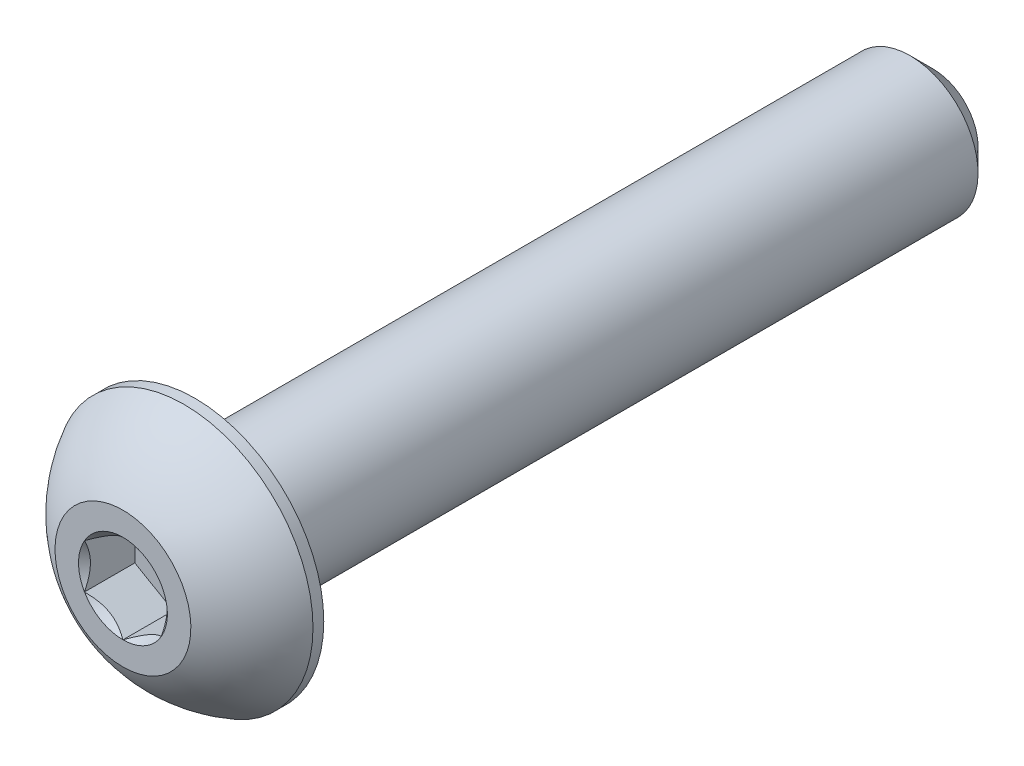
ISO-10303-21;
HEADER;
FILE_DESCRIPTION(('STEP AP214'),'2;1');
FILE_NAME('part.step','',(''),(''),'','','');
FILE_SCHEMA(('AUTOMOTIVE_DESIGN { 1 0 10303 214 1 1 1 1 }'));
ENDSEC;
DATA;
#1=APPLICATION_CONTEXT('core data for automotive mechanical design processes');
#2=APPLICATION_PROTOCOL_DEFINITION('international standard','automotive_design',2000,#1);
#3=PRODUCT_CONTEXT('',#1,'mechanical');
#4=PRODUCT('Part','Part','',(#3));
#5=PRODUCT_RELATED_PRODUCT_CATEGORY('part','',(#4));
#6=PRODUCT_DEFINITION_FORMATION('','',#4);
#7=PRODUCT_DEFINITION_CONTEXT('part definition',#1,'design');
#8=PRODUCT_DEFINITION('design','',#6,#7);
#9=PRODUCT_DEFINITION_SHAPE('','',#8);
#10=(LENGTH_UNIT() NAMED_UNIT(*) SI_UNIT(.MILLI.,.METRE.));
#11=(NAMED_UNIT(*) PLANE_ANGLE_UNIT() SI_UNIT($,.RADIAN.));
#12=(NAMED_UNIT(*) SI_UNIT($,.STERADIAN.) SOLID_ANGLE_UNIT());
#13=UNCERTAINTY_MEASURE_WITH_UNIT(LENGTH_MEASURE(1.E-05),#10,'distance_accuracy_value','');
#14=(GEOMETRIC_REPRESENTATION_CONTEXT(3) GLOBAL_UNCERTAINTY_ASSIGNED_CONTEXT((#13)) GLOBAL_UNIT_ASSIGNED_CONTEXT((#10,
#11,#12)) REPRESENTATION_CONTEXT('',''));
#15=CARTESIAN_POINT('',(0.,0.,0.));
#16=DIRECTION('',(0.,0.,1.));
#17=DIRECTION('',(1.,0.,0.));
#18=AXIS2_PLACEMENT_3D('',#15,#16,#17);
#19=CARTESIAN_POINT('',(0.,-1.7526,-20.9042));
#20=DIRECTION('',(0.,0.,-1.));
#21=DIRECTION('',(0.,1.,0.));
#22=AXIS2_PLACEMENT_3D('',#19,#20,#21);
#23=PLANE('',#22);
#24=CARTESIAN_POINT('',(0.,0.,-20.9042));
#25=DIRECTION('',(0.,0.,-1.));
#26=DIRECTION('',(0.,1.,0.));
#27=AXIS2_PLACEMENT_3D('',#24,#25,#26);
#28=CIRCLE('',#27,1.1572875);
#29=CARTESIAN_POINT('',(0.,1.15728750000001,-20.9042));
#30=VERTEX_POINT('',#29);
#31=EDGE_CURVE('E174',#30,#30,#28,.T.);
#32=ORIENTED_EDGE('',*,*,#31,.T.);
#33=EDGE_LOOP('',(#32));
#34=FACE_BOUND('',#33,.T.);
#35=ADVANCED_FACE('F34',(#34),#23,.T.);
#36=CARTESIAN_POINT('',(0.,0.,-20.9042));
#37=DIRECTION('',(0.,0.,-1.));
#38=DIRECTION('',(0.,1.,0.));
#39=AXIS2_PLACEMENT_3D('',#36,#37,#38);
#40=CYLINDRICAL_SURFACE('',#39,1.7526);
#41=CARTESIAN_POINT('',(0.,0.,-20.3088875));
#42=DIRECTION('',(0.,0.,-1.));
#43=DIRECTION('',(0.,1.,0.));
#44=AXIS2_PLACEMENT_3D('',#41,#42,#43);
#45=CIRCLE('',#44,1.7526);
#46=CARTESIAN_POINT('',(0.,1.7526,-20.3088875));
#47=VERTEX_POINT('',#46);
#48=EDGE_CURVE('E48',#47,#47,#45,.F.);
#49=ORIENTED_EDGE('',*,*,#48,.T.);
#50=EDGE_LOOP('',(#49));
#51=FACE_BOUND('',#50,.T.);
#52=CARTESIAN_POINT('',(0.,0.,-1.8542));
#53=DIRECTION('',(0.,0.,1.));
#54=DIRECTION('',(1.,0.,0.));
#55=AXIS2_PLACEMENT_3D('',#52,#53,#54);
#56=CIRCLE('',#55,1.7526);
#57=CARTESIAN_POINT('',(1.7526,0.,-1.8542));
#58=VERTEX_POINT('',#57);
#59=EDGE_CURVE('E171',#58,#58,#56,.F.);
#60=ORIENTED_EDGE('',*,*,#59,.T.);
#61=EDGE_LOOP('',(#60));
#62=FACE_BOUND('',#61,.T.);
#63=ADVANCED_FACE('F179',(#51,#62),#40,.T.);
#64=CARTESIAN_POINT('',(0.,0.,-20.9042));
#65=DIRECTION('',(0.,0.,1.));
#66=DIRECTION('',(0.,-1.,0.));
#67=AXIS2_PLACEMENT_3D('',#64,#65,#66);
#68=CONICAL_SURFACE('',#67,1.1572875,0.785398163397445);
#69=ORIENTED_EDGE('',*,*,#48,.F.);
#70=EDGE_LOOP('',(#69));
#71=FACE_BOUND('',#70,.T.);
#72=ORIENTED_EDGE('',*,*,#31,.F.);
#73=EDGE_LOOP('',(#72));
#74=FACE_BOUND('',#73,.T.);
#75=ADVANCED_FACE('F36',(#71,#74),#68,.T.);
#76=CARTESIAN_POINT('',(0.,0.,-3.32598826349718));
#77=DIRECTION('',(0.,0.,1.));
#78=DIRECTION('',(0.,-1.,0.));
#79=AXIS2_PLACEMENT_3D('',#76,#77,#78);
#80=SPHERICAL_SURFACE('',#79,3.75949527050121);
#81=CARTESIAN_POINT('',(0.,0.,0.));
#82=DIRECTION('',(0.,0.,1.));
#83=DIRECTION('',(1.,0.,0.));
#84=AXIS2_PLACEMENT_3D('',#81,#82,#83);
#85=CIRCLE('',#84,1.7526);
#86=CARTESIAN_POINT('',(0.,-1.7526,0.));
#87=VERTEX_POINT('',#86);
#88=EDGE_CURVE('E168',#87,#87,#85,.T.);
#89=CARTESIAN_POINT('',(0.,0.,-1.57607));
#90=DIRECTION('',(0.,0.,1.));
#91=DIRECTION('',(1.,0.,0.));
#92=AXIS2_PLACEMENT_3D('',#89,#90,#91);
#93=CIRCLE('',#92,3.3274);
#94=CARTESIAN_POINT('',(0.,-3.3274,-1.57607));
#95=VERTEX_POINT('',#94);
#96=EDGE_CURVE('E162',#95,#95,#93,.T.);
#97=CARTESIAN_POINT('',(0.,-1.7526,0.));
#98=CARTESIAN_POINT('',(0.,-1.77344521091165,-0.0109841671242039));
#99=CARTESIAN_POINT('',(0.,-1.79418713228591,-0.0221643495093442));
#100=CARTESIAN_POINT('',(0.,-1.83545712312919,-0.0449126843404109));
#101=CARTESIAN_POINT('',(0.,-1.85598519259821,-0.0564808367863374));
#102=CARTESIAN_POINT('',(0.,-1.89682020680057,-0.0800010512778898));
#103=CARTESIAN_POINT('',(0.,-1.9171271515339,-0.0919531133235156));
#104=CARTESIAN_POINT('',(0.,-1.95751274186056,-0.116236914088468));
#105=CARTESIAN_POINT('',(0.,-1.97759138745388,-0.128568652807795));
#106=CARTESIAN_POINT('',(0.,-2.01751328037423,-0.15360744962207));
#107=CARTESIAN_POINT('',(0.,-2.03735652770125,-0.166314507717019));
#108=CARTESIAN_POINT('',(0.,-2.07680060963244,-0.192099450667238));
#109=CARTESIAN_POINT('',(0.,-2.09640144423661,-0.205177335522508));
#110=CARTESIAN_POINT('',(0.,-2.13535377157089,-0.231699308994505));
#111=CARTESIAN_POINT('',(0.,-2.15470526430101,-0.245143397611231));
#112=CARTESIAN_POINT('',(0.,-2.19315206698496,-0.27239302596156));
#113=CARTESIAN_POINT('',(0.,-2.2122473769388,-0.286198565695163));
#114=CARTESIAN_POINT('',(0.,-2.25017506370288,-0.314166215909251));
#115=CARTESIAN_POINT('',(0.,-2.26900744051312,-0.328328326389737));
#116=CARTESIAN_POINT('',(0.,-2.3064026035794,-0.357004111663073));
#117=CARTESIAN_POINT('',(0.,-2.32496538983544,-0.371517786455924));
#118=CARTESIAN_POINT('',(0.,-2.36181480968332,-0.400891569642019));
#119=CARTESIAN_POINT('',(0.,-2.38010144327516,-0.415751678035262));
#120=CARTESIAN_POINT('',(0.,-2.41639209330763,-0.445813075241839));
#121=CARTESIAN_POINT('',(0.,-2.43439610974826,-0.461014364055173));
#122=CARTESIAN_POINT('',(0.,-2.47011516089881,-0.49175274831159));
#123=CARTESIAN_POINT('',(0.,-2.48783019560872,-0.507289843754673));
#124=CARTESIAN_POINT('',(0.,-2.52296502087598,-0.538694348769552));
#125=CARTESIAN_POINT('',(0.,-2.54038481143333,-0.554561758341348));
#126=CARTESIAN_POINT('',(0.,-2.57492299034501,-0.586621282343664));
#127=CARTESIAN_POINT('',(0.,-2.59204137869935,-0.602813396774184));
#128=CARTESIAN_POINT('',(0.,-2.62597070170293,-0.635516606437908));
#129=CARTESIAN_POINT('',(0.,-2.64278163635217,-0.652027701671111));
#130=CARTESIAN_POINT('',(0.,-2.67609010913108,-0.685363036121617));
#131=CARTESIAN_POINT('',(0.,-2.69258764726075,-0.70218727533892));
#132=CARTESIAN_POINT('',(0.,-2.72526349497449,-0.736142950239868));
#133=CARTESIAN_POINT('',(0.,-2.74144180455856,-0.753274385923513));
#134=CARTESIAN_POINT('',(0.,-2.7734734760052,-0.787838397642713));
#135=CARTESIAN_POINT('',(0.,-2.78932683786777,-0.805270973678267));
#136=CARTESIAN_POINT('',(0.,-2.82070300956741,-0.840431103531066));
#137=CARTESIAN_POINT('',(0.,-2.83622581940447,-0.858158657348309));
#138=CARTESIAN_POINT('',(0.,-2.86693539960216,-0.893902475917014));
#139=CARTESIAN_POINT('',(0.,-2.88212216996277,-0.911918740668475));
#140=CARTESIAN_POINT('',(0.,-2.91215430254962,-0.948233612196229));
#141=CARTESIAN_POINT('',(0.,-2.92699966477584,-0.966532218972523));
#142=CARTESIAN_POINT('',(0.,-2.9563437331265,-1.00340530583029));
#143=CARTESIAN_POINT('',(0.,-2.97084243925094,-1.02197978591176));
#144=CARTESIAN_POINT('',(0.,-2.99948806997761,-1.05939805313604));
#145=CARTESIAN_POINT('',(0.,-3.01363499457984,-1.07824184027885));
#146=CARTESIAN_POINT('',(0.,-3.04157206119591,-1.11619206018152));
#147=CARTESIAN_POINT('',(0.,-3.05536220320976,-1.13529849294138));
#148=CARTESIAN_POINT('',(0.,-3.08258082972231,-1.17376724977884));
#149=CARTESIAN_POINT('',(0.,-3.09600931422102,-1.19312957385645));
#150=CARTESIAN_POINT('',(0.,-3.12249987857489,-1.23210326859816));
#151=CARTESIAN_POINT('',(0.,-3.13556195843005,-1.25171463926226));
#152=CARTESIAN_POINT('',(0.,-3.16131509608524,-1.29117949430132));
#153=CARTESIAN_POINT('',(0.,-3.17400615388527,-1.31103297867626));
#154=CARTESIAN_POINT('',(0.,-3.19901276047088,-1.3509750430611));
#155=CARTESIAN_POINT('',(0.,-3.21132830925647,-1.37106362307099));
#156=CARTESIAN_POINT('',(0.,-3.23557954623934,-1.4114687760892));
#157=CARTESIAN_POINT('',(0.,-3.24751523443662,-1.43178534909752));
#158=CARTESIAN_POINT('',(0.,-3.27100252310173,-1.47263931029833));
#159=CARTESIAN_POINT('',(0.,-3.28255412356956,-1.49317669849081));
#160=CARTESIAN_POINT('',(0.,-3.30526918217882,-1.53446501395861));
#161=CARTESIAN_POINT('',(0.,-3.31643264032025,-1.55521594123393));
#162=CARTESIAN_POINT('',(0.,-3.3274,-1.57607));
#163=B_SPLINE_CURVE_WITH_KNOTS('',3,(#97,#98,#99,#100,#101,#102,#103,#104,#105,#106,#107,#108,
#109,#110,#111,#112,#113,#114,#115,#116,#117,#118,#119,#120,#121,#122,#123,#124,#125,#126,#127,
#128,#129,#130,#131,#132,#133,#134,#135,#136,#137,#138,#139,#140,#141,#142,#143,#144,#145,#146,
#147,#148,#149,#150,#151,#152,#153,#154,#155,#156,#157,#158,#159,#160,#161,#162),.UNSPECIFIED.,
.F.,.F.,(4,2,2,2,2,2,2,2,2,2,2,2,2,2,2,2,2,2,2,2,2,2,2,2,2,2,2,2,2,2,2,2,4),(0.,
0.0706853966104393,0.141370793220879,0.212056189831318,0.282741586441758,0.353426983052197,
0.424112379662636,0.494797776273076,0.565483172883515,0.636168569493955,0.706853966104394,
0.777539362714833,0.848224759325273,0.918910155935712,0.989595552546152,1.06028094915659,
1.13096634576703,1.20165174237747,1.27233713898791,1.34302253559835,1.41370793220879,
1.48439332881923,1.55507872542967,1.62576412204011,1.69644951865055,1.76713491526098,
1.83782031187142,1.90850570848186,1.9791911050923,2.04987650170274,2.12056189831318,
2.19124729492362,2.26193269153406),.UNSPECIFIED.);
#164=EDGE_CURVE('BSEAM184',#87,#95,#163,.T.);
#165=ORIENTED_EDGE('',*,*,#88,.F.);
#166=ORIENTED_EDGE('',*,*,#96,.T.);
#167=ORIENTED_EDGE('',*,*,#164,.T.);
#168=ORIENTED_EDGE('',*,*,#164,.F.);
#169=EDGE_LOOP('',(#165,#167,#166,#168));
#170=FACE_BOUND('',#169,.T.);
#171=ADVANCED_FACE('F184',(#170),#80,.T.);
#172=CARTESIAN_POINT('',(0.,-1.7526,0.));
#173=DIRECTION('',(0.,0.,-1.));
#174=DIRECTION('',(-1.,0.,0.));
#175=AXIS2_PLACEMENT_3D('',#172,#173,#174);
#176=PLANE('',#175);
#177=CARTESIAN_POINT('',(0.,0.,0.));
#178=DIRECTION('',(0.,0.,1.));
#179=DIRECTION('',(1.,0.,0.));
#180=AXIS2_PLACEMENT_3D('',#177,#178,#179);
#181=CIRCLE('',#180,1.14567944042316);
#182=CARTESIAN_POINT('',(-0.9921875,0.572839720211582,0.));
#183=VERTEX_POINT('',#182);
#184=CARTESIAN_POINT('',(-0.9921875,-0.572839720211582,0.));
#185=VERTEX_POINT('',#184);
#186=EDGE_CURVE('E61',#183,#185,#181,.T.);
#187=ORIENTED_EDGE('',*,*,#186,.F.);
#188=CARTESIAN_POINT('',(0.,1.14567944042316,0.));
#189=VERTEX_POINT('',#188);
#190=EDGE_CURVE('E133',#189,#183,#181,.T.);
#191=ORIENTED_EDGE('',*,*,#190,.F.);
#192=CARTESIAN_POINT('',(0.9921875,0.572839720211582,0.));
#193=VERTEX_POINT('',#192);
#194=EDGE_CURVE('E130',#193,#189,#181,.T.);
#195=ORIENTED_EDGE('',*,*,#194,.F.);
#196=CARTESIAN_POINT('',(0.9921875,-0.572839720211582,0.));
#197=VERTEX_POINT('',#196);
#198=EDGE_CURVE('E101',#197,#193,#181,.T.);
#199=ORIENTED_EDGE('',*,*,#198,.F.);
#200=CARTESIAN_POINT('',(0.,-1.14567944042316,0.));
#201=VERTEX_POINT('',#200);
#202=EDGE_CURVE('E93',#201,#197,#181,.T.);
#203=ORIENTED_EDGE('',*,*,#202,.F.);
#204=EDGE_CURVE('E54',#185,#201,#181,.T.);
#205=ORIENTED_EDGE('',*,*,#204,.F.);
#206=EDGE_LOOP('',(#187,#191,#195,#199,#203,#205));
#207=FACE_BOUND('',#206,.T.);
#208=ORIENTED_EDGE('',*,*,#88,.T.);
#209=EDGE_LOOP('',(#208));
#210=FACE_BOUND('',#209,.T.);
#211=ADVANCED_FACE('F127',(#207,#210),#176,.F.);
#212=CARTESIAN_POINT('',(0.,-3.3274,-1.8542));
#213=DIRECTION('',(0.,0.,1.));
#214=DIRECTION('',(1.,0.,0.));
#215=AXIS2_PLACEMENT_3D('',#212,#213,#214);
#216=PLANE('',#215);
#217=ORIENTED_EDGE('',*,*,#59,.F.);
#218=EDGE_LOOP('',(#217));
#219=FACE_BOUND('',#218,.T.);
#220=CARTESIAN_POINT('',(0.,0.,-1.8542));
#221=DIRECTION('',(0.,0.,1.));
#222=DIRECTION('',(1.,0.,0.));
#223=AXIS2_PLACEMENT_3D('',#220,#221,#222);
#224=CIRCLE('',#223,3.3274);
#225=CARTESIAN_POINT('',(3.3274,0.,-1.8542));
#226=VERTEX_POINT('',#225);
#227=EDGE_CURVE('E165',#226,#226,#224,.T.);
#228=ORIENTED_EDGE('',*,*,#227,.F.);
#229=EDGE_LOOP('',(#228));
#230=FACE_BOUND('',#229,.T.);
#231=ADVANCED_FACE('F198',(#219,#230),#216,.F.);
#232=CARTESIAN_POINT('',(0.,0.,0.));
#233=DIRECTION('',(0.,0.,1.));
#234=DIRECTION('',(1.,0.,0.));
#235=AXIS2_PLACEMENT_3D('',#232,#233,#234);
#236=CYLINDRICAL_SURFACE('',#235,3.3274);
#237=ORIENTED_EDGE('',*,*,#96,.F.);
#238=EDGE_LOOP('',(#237));
#239=FACE_BOUND('',#238,.T.);
#240=ORIENTED_EDGE('',*,*,#227,.T.);
#241=EDGE_LOOP('',(#240));
#242=FACE_BOUND('',#241,.T.);
#243=ADVANCED_FACE('F201',(#239,#242),#236,.T.);
#244=CARTESIAN_POINT('',(0.,0.,0.));
#245=DIRECTION('',(0.,0.,1.));
#246=DIRECTION('',(1.,0.,0.));
#247=AXIS2_PLACEMENT_3D('',#244,#245,#246);
#248=CONICAL_SURFACE('',#247,1.14567944042316,0.78539816339745);
#249=ORIENTED_EDGE('',*,*,#198,.T.);
#250=CARTESIAN_POINT('',(0.9921875,-1.14247621078911,0.367492039408284));
#251=CARTESIAN_POINT('',(0.9921875,-1.11465764801141,0.346491639249698));
#252=CARTESIAN_POINT('',(0.9921875,-1.08668408094051,0.325697147705785));
#253=CARTESIAN_POINT('',(0.9921875,-1.03036405365905,0.284605037686905));
#254=CARTESIAN_POINT('',(0.9921875,-1.00201750223733,0.264307544357067));
#255=CARTESIAN_POINT('',(0.9921875,-0.915909012346496,0.203998507493926));
#256=CARTESIAN_POINT('',(0.9921875,-0.857501195839067,0.164893852172636));
#257=CARTESIAN_POINT('',(0.9921875,-0.735022281240404,0.0881267527611405));
#258=CARTESIAN_POINT('',(0.9921875,-0.670818221894543,0.0506740309962608));
#259=CARTESIAN_POINT('',(0.9921875,-0.539203244212803,-0.0178349795389534));
#260=CARTESIAN_POINT('',(0.9921875,-0.471804118965061,-0.0489128317456888));
#261=CARTESIAN_POINT('',(0.9921875,-0.370637445252798,-0.0869337037637354));
#262=CARTESIAN_POINT('',(0.9921875,-0.338367677251603,-0.0978459676675487));
#263=CARTESIAN_POINT('',(0.9921875,-0.273049086247197,-0.117079769900667));
#264=CARTESIAN_POINT('',(0.9921875,-0.240000209742886,-0.125401129752807));
#265=CARTESIAN_POINT('',(0.9921875,-0.173878395816094,-0.138881226317852));
#266=CARTESIAN_POINT('',(0.9921875,-0.14081677471647,-0.144094606034908));
#267=CARTESIAN_POINT('',(0.9921875,-0.0743291671992143,-0.151260287542944));
#268=CARTESIAN_POINT('',(0.9921875,-0.0409031259919573,-0.153212091964575));
#269=CARTESIAN_POINT('',(0.9921875,0.0247631141129255,-0.153706514094286));
#270=CARTESIAN_POINT('',(0.9921875,0.0570024445003671,-0.152369968579246));
#271=CARTESIAN_POINT('',(0.9921875,0.121194220501071,-0.146628956786164));
#272=CARTESIAN_POINT('',(0.9921875,0.153146730366263,-0.142225195906134));
#273=CARTESIAN_POINT('',(0.9921875,0.217090524657736,-0.130515488840306));
#274=CARTESIAN_POINT('',(0.9921875,0.249072542149665,-0.123159697563355));
#275=CARTESIAN_POINT('',(0.9921875,0.312337779758396,-0.105936908614596));
#276=CARTESIAN_POINT('',(0.9921875,0.343621058108106,-0.0960701210649898));
#277=CARTESIAN_POINT('',(0.9921875,0.442112983138563,-0.0612938884031196));
#278=CARTESIAN_POINT('',(0.9921875,0.50791977119888,-0.0324238358491881));
#279=CARTESIAN_POINT('',(0.9921875,0.636441891183645,0.0317652099233282));
#280=CARTESIAN_POINT('',(0.9921875,0.699145053961295,0.0671073722096531));
#281=CARTESIAN_POINT('',(0.9921875,0.818979830095494,0.140021370867662));
#282=CARTESIAN_POINT('',(0.9921875,0.876233471712468,0.177395135048467));
#283=CARTESIAN_POINT('',(0.9921875,0.960585190784999,0.235171111904544));
#284=CARTESIAN_POINT('',(0.9921875,0.988338378424189,0.254633487670958));
#285=CARTESIAN_POINT('',(0.9921875,1.04346551341387,0.294072981771729));
#286=CARTESIAN_POINT('',(0.9921875,1.07083956239906,0.314049957884778));
#287=CARTESIAN_POINT('',(0.9921875,1.09805574523311,0.334240305642713));
#288=B_SPLINE_CURVE_WITH_KNOTS('',3,(#250,#251,#252,#253,#254,#255,#256,#257,#258,#259,#260,
#261,#262,#263,#264,#265,#266,#267,#268,#269,#270,#271,#272,#273,#274,#275,#276,#277,#278,#279,
#280,#281,#282,#283,#284,#285,#286,#287),.UNSPECIFIED.,.F.,.F.,(4,2,2,2,2,2,2,2,2,2,2,2,2,2,2,2,
2,2,4),(0.,0.104563127371702,0.209152318679108,0.419927098975113,0.642732653870156,
0.864771652131277,0.966879847039378,1.06899507422301,1.16925752982867,1.26953527342202,
1.36618351686957,1.46280954049584,1.56114078094885,1.65946379566813,1.87441437168727,
2.09015003608822,2.29516517576016,2.39685303378669,2.49851308339968),.UNSPECIFIED.);
#289=EDGE_CURVE('E11',#197,#193,#288,.T.);
#290=ORIENTED_EDGE('',*,*,#289,.F.);
#291=EDGE_LOOP('',(#249,#290));
#292=FACE_BOUND('',#291,.T.);
#293=ADVANCED_FACE('F105',(#292),#248,.F.);
#294=ORIENTED_EDGE('',*,*,#194,.T.);
#295=CARTESIAN_POINT('',(0.9923875,0.572724250157744,0.000115487508968476));
#296=CARTESIAN_POINT('',(0.958273424767844,0.592420020676185,-0.0195671885953468));
#297=CARTESIAN_POINT('',(0.92358891050772,0.612445134320978,-0.0380943154815884));
#298=CARTESIAN_POINT('',(0.852862918800041,0.653278804672111,-0.0720176703495943));
#299=CARTESIAN_POINT('',(0.816814708375758,0.674091248664375,-0.0873950127690514));
#300=CARTESIAN_POINT('',(0.744124988262604,0.716058678139022,-0.113736857265722));
#301=CARTESIAN_POINT('',(0.707502010986799,0.737202963927734,-0.124767603486859));
#302=CARTESIAN_POINT('',(0.633449993753943,0.779956916011158,-0.141763794327058));
#303=CARTESIAN_POINT('',(0.596023217440657,0.801565275390534,-0.147741932421081));
#304=CARTESIAN_POINT('',(0.531522861394529,0.838804573316593,-0.153133655085706));
#305=CARTESIAN_POINT('',(0.50453320068547,0.854387061192304,-0.153931003611658));
#306=CARTESIAN_POINT('',(0.450606144054335,0.885521861854894,-0.152591806638577));
#307=CARTESIAN_POINT('',(0.42366876097576,0.901074167226574,-0.150454613862953));
#308=CARTESIAN_POINT('',(0.343241277041502,0.947508996726262,-0.139782428693979));
#309=CARTESIAN_POINT('',(0.290151430636717,0.978160433839301,-0.126985619277286));
#310=CARTESIAN_POINT('',(0.196972862034202,1.03195710550467,-0.0961025323498723));
#311=CARTESIAN_POINT('',(0.156447193690483,1.055354611032,-0.0796349910922947));
#312=CARTESIAN_POINT('',(0.0769831842917926,1.10123317824922,-0.042539616443191));
#313=CARTESIAN_POINT('',(0.0380401617384764,1.12371694280344,-0.0219253193544624));
#314=CARTESIAN_POINT('',(-0.000199999999999984,1.145794910477,0.000115487508968402));
#315=B_SPLINE_CURVE_WITH_KNOTS('',3,(#295,#296,#297,#298,#299,#300,#301,#302,#303,#304,#305,
#306,#307,#308,#309,#310,#311,#312,#313,#314),.UNSPECIFIED.,.F.,.F.,(4,2,2,2,2,2,2,2,2,4),(0.,
0.13219718521019,0.265165186853263,0.39602009760567,0.526545281028574,0.619935205043265,
0.713345731536165,0.90022005184637,1.04884529769095,1.1969930355767),.UNSPECIFIED.);
#316=EDGE_CURVE('E132',#193,#189,#315,.T.);
#317=ORIENTED_EDGE('',*,*,#316,.F.);
#318=EDGE_LOOP('',(#294,#317));
#319=FACE_BOUND('',#318,.T.);
#320=ADVANCED_FACE('F286',(#319),#248,.F.);
#321=ORIENTED_EDGE('',*,*,#190,.T.);
#322=CARTESIAN_POINT('',(0.000199999999999865,1.145794910477,0.000115487508968564));
#323=CARTESIAN_POINT('',(-0.0339140752321561,1.12609913995856,-0.0195671885953467));
#324=CARTESIAN_POINT('',(-0.0685985894922798,1.10607402631377,-0.0380943154815884));
#325=CARTESIAN_POINT('',(-0.139324581199959,1.06524035596264,-0.0720176703495943));
#326=CARTESIAN_POINT('',(-0.175372791624242,1.04442791197037,-0.0873950127690514));
#327=CARTESIAN_POINT('',(-0.248062511737396,1.00246048249572,-0.113736857265722));
#328=CARTESIAN_POINT('',(-0.284685489013201,0.981316196707012,-0.124767603486859));
#329=CARTESIAN_POINT('',(-0.358737506246056,0.938562244623588,-0.141763794327058));
#330=CARTESIAN_POINT('',(-0.396164282559343,0.916953885244212,-0.147741932421081));
#331=CARTESIAN_POINT('',(-0.460664638605471,0.879714587318153,-0.153133655085706));
#332=CARTESIAN_POINT('',(-0.48765429931453,0.864132099442442,-0.153931003611658));
#333=CARTESIAN_POINT('',(-0.541581355945664,0.832997298779852,-0.152591806638578));
#334=CARTESIAN_POINT('',(-0.56851873902424,0.817444993408172,-0.150454613862953));
#335=CARTESIAN_POINT('',(-0.648946222958497,0.771010163908484,-0.139782428693979));
#336=CARTESIAN_POINT('',(-0.702036069363283,0.740358726795446,-0.126985619277287));
#337=CARTESIAN_POINT('',(-0.795214637965797,0.68656205513008,-0.0961025323498729));
#338=CARTESIAN_POINT('',(-0.835740306309516,0.663164549602744,-0.0796349910922953));
#339=CARTESIAN_POINT('',(-0.915204315708207,0.617285982385523,-0.0425396164431916));
#340=CARTESIAN_POINT('',(-0.954147338261523,0.594802217831308,-0.0219253193544629));
#341=CARTESIAN_POINT('',(-0.9923875,0.572724250157744,0.000115487508968092));
#342=B_SPLINE_CURVE_WITH_KNOTS('',3,(#322,#323,#324,#325,#326,#327,#328,#329,#330,#331,#332,
#333,#334,#335,#336,#337,#338,#339,#340,#341),.UNSPECIFIED.,.F.,.F.,(4,2,2,2,2,2,2,2,2,4),(0.,
0.13219718521019,0.265165186853263,0.39602009760567,0.526545281028574,0.619935205043265,
0.713345731536164,0.900220051846369,1.04884529769095,1.1969930355767),.UNSPECIFIED.);
#343=EDGE_CURVE('E137',#189,#183,#342,.T.);
#344=ORIENTED_EDGE('',*,*,#343,.F.);
#345=EDGE_LOOP('',(#321,#344));
#346=FACE_BOUND('',#345,.T.);
#347=ADVANCED_FACE('F140',(#346),#248,.F.);
#348=ORIENTED_EDGE('',*,*,#186,.T.);
#349=CARTESIAN_POINT('',(-0.9921875,-1.14247621078911,0.367492039408284));
#350=CARTESIAN_POINT('',(-0.9921875,-1.11465764801141,0.346491639249699));
#351=CARTESIAN_POINT('',(-0.9921875,-1.08668408094051,0.325697147705785));
#352=CARTESIAN_POINT('',(-0.9921875,-1.03036405365905,0.284605037686906));
#353=CARTESIAN_POINT('',(-0.9921875,-1.00201750223733,0.264307544357067));
#354=CARTESIAN_POINT('',(-0.9921875,-0.915909012346497,0.203998507493927));
#355=CARTESIAN_POINT('',(-0.9921875,-0.857501195839067,0.164893852172636));
#356=CARTESIAN_POINT('',(-0.9921875,-0.735022281240405,0.0881267527611405));
#357=CARTESIAN_POINT('',(-0.9921875,-0.670818221894543,0.050674030996261));
#358=CARTESIAN_POINT('',(-0.9921875,-0.539203244212803,-0.0178349795389532));
#359=CARTESIAN_POINT('',(-0.9921875,-0.471804118965062,-0.0489128317456889));
#360=CARTESIAN_POINT('',(-0.9921875,-0.370637445252798,-0.0869337037637353));
#361=CARTESIAN_POINT('',(-0.9921875,-0.338367677251604,-0.0978459676675485));
#362=CARTESIAN_POINT('',(-0.9921875,-0.273049086247197,-0.117079769900666));
#363=CARTESIAN_POINT('',(-0.9921875,-0.240000209742887,-0.125401129752807));
#364=CARTESIAN_POINT('',(-0.9921875,-0.173878395816094,-0.138881226317852));
#365=CARTESIAN_POINT('',(-0.9921875,-0.140816774716471,-0.144094606034908));
#366=CARTESIAN_POINT('',(-0.9921875,-0.0743291671992143,-0.151260287542943));
#367=CARTESIAN_POINT('',(-0.9921875,-0.0409031259919574,-0.153212091964575));
#368=CARTESIAN_POINT('',(-0.9921875,0.0247631141129255,-0.153706514094286));
#369=CARTESIAN_POINT('',(-0.9921875,0.0570024445003671,-0.152369968579246));
#370=CARTESIAN_POINT('',(-0.9921875,0.121194220501071,-0.146628956786164));
#371=CARTESIAN_POINT('',(-0.9921875,0.153146730366263,-0.142225195906134));
#372=CARTESIAN_POINT('',(-0.9921875,0.217090524657736,-0.130515488840306));
#373=CARTESIAN_POINT('',(-0.9921875,0.249072542149665,-0.123159697563355));
#374=CARTESIAN_POINT('',(-0.9921875,0.312337779758396,-0.105936908614596));
#375=CARTESIAN_POINT('',(-0.9921875,0.343621058108106,-0.0960701210649898));
#376=CARTESIAN_POINT('',(-0.9921875,0.442112983138562,-0.0612938884031196));
#377=CARTESIAN_POINT('',(-0.9921875,0.507919771198879,-0.0324238358491882));
#378=CARTESIAN_POINT('',(-0.9921875,0.636441891183645,0.0317652099233279));
#379=CARTESIAN_POINT('',(-0.9921875,0.699145053961294,0.0671073722096529));
#380=CARTESIAN_POINT('',(-0.9921875,0.818979830095494,0.140021370867661));
#381=CARTESIAN_POINT('',(-0.9921875,0.876233471712468,0.177395135048466));
#382=CARTESIAN_POINT('',(-0.9921875,0.960585190784998,0.235171111904544));
#383=CARTESIAN_POINT('',(-0.9921875,0.988338378424188,0.254633487670958));
#384=CARTESIAN_POINT('',(-0.9921875,1.04346551341387,0.294072981771729));
#385=CARTESIAN_POINT('',(-0.9921875,1.07083956239906,0.314049957884777));
#386=CARTESIAN_POINT('',(-0.9921875,1.09805574523311,0.334240305642713));
#387=B_SPLINE_CURVE_WITH_KNOTS('',3,(#349,#350,#351,#352,#353,#354,#355,#356,#357,#358,#359,
#360,#361,#362,#363,#364,#365,#366,#367,#368,#369,#370,#371,#372,#373,#374,#375,#376,#377,#378,
#379,#380,#381,#382,#383,#384,#385,#386),.UNSPECIFIED.,.F.,.F.,(4,2,2,2,2,2,2,2,2,2,2,2,2,2,2,2,
2,2,4),(0.,0.104563127371703,0.209152318679108,0.419927098975114,0.642732653870156,
0.864771652131277,0.966879847039379,1.06899507422301,1.16925752982867,1.26953527342202,
1.36618351686957,1.46280954049584,1.56114078094885,1.65946379566813,1.87441437168727,
2.09015003608822,2.29516517576016,2.39685303378669,2.49851308339968),.UNSPECIFIED.);
#388=EDGE_CURVE('E144',#183,#185,#387,.F.);
#389=ORIENTED_EDGE('',*,*,#388,.F.);
#390=EDGE_LOOP('',(#348,#389));
#391=FACE_BOUND('',#390,.T.);
#392=ADVANCED_FACE('F280',(#391),#248,.F.);
#393=ORIENTED_EDGE('',*,*,#204,.T.);
#394=CARTESIAN_POINT('',(-0.9923875,-0.572724250157744,0.000115487508968476));
#395=CARTESIAN_POINT('',(-0.958273424767844,-0.592420020676185,-0.0195671885953467));
#396=CARTESIAN_POINT('',(-0.92358891050772,-0.612445134320978,-0.0380943154815883));
#397=CARTESIAN_POINT('',(-0.852862918800041,-0.653278804672111,-0.0720176703495943));
#398=CARTESIAN_POINT('',(-0.816814708375758,-0.674091248664375,-0.0873950127690514));
#399=CARTESIAN_POINT('',(-0.744124988262604,-0.716058678139022,-0.113736857265722));
#400=CARTESIAN_POINT('',(-0.707502010986799,-0.737202963927734,-0.124767603486859));
#401=CARTESIAN_POINT('',(-0.633449993753943,-0.779956916011158,-0.141763794327058));
#402=CARTESIAN_POINT('',(-0.596023217440657,-0.801565275390534,-0.147741932421081));
#403=CARTESIAN_POINT('',(-0.531522861394529,-0.838804573316592,-0.153133655085706));
#404=CARTESIAN_POINT('',(-0.50453320068547,-0.854387061192304,-0.153931003611658));
#405=CARTESIAN_POINT('',(-0.450606144054336,-0.885521861854894,-0.152591806638577));
#406=CARTESIAN_POINT('',(-0.42366876097576,-0.901074167226574,-0.150454613862952));
#407=CARTESIAN_POINT('',(-0.343241277041502,-0.947508996726262,-0.139782428693979));
#408=CARTESIAN_POINT('',(-0.290151430636717,-0.9781604338393,-0.126985619277286));
#409=CARTESIAN_POINT('',(-0.196972862034202,-1.03195710550467,-0.0961025323498722));
#410=CARTESIAN_POINT('',(-0.156447193690483,-1.055354611032,-0.0796349910922947));
#411=CARTESIAN_POINT('',(-0.0769831842917926,-1.10123317824922,-0.042539616443191));
#412=CARTESIAN_POINT('',(-0.0380401617384764,-1.12371694280344,-0.0219253193544624));
#413=CARTESIAN_POINT('',(0.000200000000000065,-1.145794910477,0.000115487508968714));
#414=B_SPLINE_CURVE_WITH_KNOTS('',3,(#394,#395,#396,#397,#398,#399,#400,#401,#402,#403,#404,
#405,#406,#407,#408,#409,#410,#411,#412,#413),.UNSPECIFIED.,.F.,.F.,(4,2,2,2,2,2,2,2,2,4),(0.,
0.13219718521019,0.265165186853263,0.39602009760567,0.526545281028574,0.619935205043265,
0.713345731536165,0.900220051846369,1.04884529769095,1.1969930355767),.UNSPECIFIED.);
#415=EDGE_CURVE('E117',#185,#201,#414,.T.);
#416=ORIENTED_EDGE('',*,*,#415,.F.);
#417=EDGE_LOOP('',(#393,#416));
#418=FACE_BOUND('',#417,.T.);
#419=ADVANCED_FACE('F228',(#418),#248,.F.);
#420=ORIENTED_EDGE('',*,*,#202,.T.);
#421=CARTESIAN_POINT('',(-0.00019999999999975,-1.145794910477,0.00011548750896878));
#422=CARTESIAN_POINT('',(0.0339140752321562,-1.12609913995856,-0.0195671885953464));
#423=CARTESIAN_POINT('',(0.06859858949228,-1.10607402631377,-0.038094315481588));
#424=CARTESIAN_POINT('',(0.13932458119996,-1.06524035596264,-0.0720176703495939));
#425=CARTESIAN_POINT('',(0.175372791624243,-1.04442791197037,-0.0873950127690511));
#426=CARTESIAN_POINT('',(0.248062511737396,-1.00246048249572,-0.113736857265722));
#427=CARTESIAN_POINT('',(0.284685489013202,-0.981316196707012,-0.124767603486859));
#428=CARTESIAN_POINT('',(0.358737506246057,-0.938562244623588,-0.141763794327058));
#429=CARTESIAN_POINT('',(0.396164282559343,-0.916953885244212,-0.147741932421081));
#430=CARTESIAN_POINT('',(0.460664638605471,-0.879714587318153,-0.153133655085706));
#431=CARTESIAN_POINT('',(0.48765429931453,-0.864132099442442,-0.153931003611658));
#432=CARTESIAN_POINT('',(0.541581355945665,-0.832997298779852,-0.152591806638577));
#433=CARTESIAN_POINT('',(0.56851873902424,-0.817444993408172,-0.150454613862952));
#434=CARTESIAN_POINT('',(0.648946222958498,-0.771010163908484,-0.139782428693979));
#435=CARTESIAN_POINT('',(0.702036069363283,-0.740358726795445,-0.126985619277286));
#436=CARTESIAN_POINT('',(0.795214637965798,-0.68656205513008,-0.0961025323498725));
#437=CARTESIAN_POINT('',(0.835740306309517,-0.663164549602744,-0.079634991092295));
#438=CARTESIAN_POINT('',(0.915204315708207,-0.617285982385523,-0.0425396164431914));
#439=CARTESIAN_POINT('',(0.954147338261523,-0.594802217831308,-0.0219253193544628));
#440=CARTESIAN_POINT('',(0.9923875,-0.572724250157744,0.000115487508968175));
#441=B_SPLINE_CURVE_WITH_KNOTS('',3,(#421,#422,#423,#424,#425,#426,#427,#428,#429,#430,#431,
#432,#433,#434,#435,#436,#437,#438,#439,#440),.UNSPECIFIED.,.F.,.F.,(4,2,2,2,2,2,2,2,2,4),(0.,
0.13219718521019,0.265165186853263,0.39602009760567,0.526545281028575,0.619935205043265,
0.713345731536165,0.90022005184637,1.04884529769095,1.1969930355767),.UNSPECIFIED.);
#442=EDGE_CURVE('E97',#201,#197,#441,.T.);
#443=ORIENTED_EDGE('',*,*,#442,.F.);
#444=EDGE_LOOP('',(#420,#443));
#445=FACE_BOUND('',#444,.T.);
#446=ADVANCED_FACE('F95',(#445),#248,.F.);
#447=CARTESIAN_POINT('',(0.9921875,-0.572839720211582,-1.29794));
#448=DIRECTION('',(0.,0.,1.));
#449=DIRECTION('',(1.,0.,0.));
#450=AXIS2_PLACEMENT_3D('',#447,#448,#449);
#451=PLANE('',#450);
#452=DIRECTION('',(0.866025403784438,0.5,0.));
#453=VECTOR('',#452,1.);
#454=CARTESIAN_POINT('',(0.,-1.14567944042316,-1.29794));
#455=LINE('',#454,#453);
#456=CARTESIAN_POINT('',(0.,-1.14567944042316,-1.29794));
#457=VERTEX_POINT('',#456);
#458=CARTESIAN_POINT('',(0.9921875,-0.572839720211582,-1.29794));
#459=VERTEX_POINT('',#458);
#460=EDGE_CURVE('E116',#457,#459,#455,.T.);
#461=ORIENTED_EDGE('',*,*,#460,.T.);
#462=DIRECTION('',(0.,1.,0.));
#463=VECTOR('',#462,1.);
#464=CARTESIAN_POINT('',(0.9921875,-0.572839720211582,-1.29794));
#465=LINE('',#464,#463);
#466=CARTESIAN_POINT('',(0.9921875,0.572839720211582,-1.29794));
#467=VERTEX_POINT('',#466);
#468=EDGE_CURVE('E121',#459,#467,#465,.T.);
#469=ORIENTED_EDGE('',*,*,#468,.T.);
#470=DIRECTION('',(-0.866025403784439,0.5,0.));
#471=VECTOR('',#470,1.);
#472=CARTESIAN_POINT('',(0.9921875,0.572839720211582,-1.29794));
#473=LINE('',#472,#471);
#474=CARTESIAN_POINT('',(0.,1.14567944042316,-1.29794));
#475=VERTEX_POINT('',#474);
#476=EDGE_CURVE('E270',#467,#475,#473,.T.);
#477=ORIENTED_EDGE('',*,*,#476,.T.);
#478=DIRECTION('',(-0.866025403784439,-0.5,0.));
#479=VECTOR('',#478,1.);
#480=CARTESIAN_POINT('',(0.,1.14567944042316,-1.29794));
#481=LINE('',#480,#479);
#482=CARTESIAN_POINT('',(-0.9921875,0.572839720211582,-1.29794));
#483=VERTEX_POINT('',#482);
#484=EDGE_CURVE('E153',#475,#483,#481,.T.);
#485=ORIENTED_EDGE('',*,*,#484,.T.);
#486=DIRECTION('',(0.,-1.,0.));
#487=VECTOR('',#486,1.);
#488=CARTESIAN_POINT('',(-0.9921875,0.572839720211582,-1.29794));
#489=LINE('',#488,#487);
#490=CARTESIAN_POINT('',(-0.9921875,-0.572839720211582,-1.29794));
#491=VERTEX_POINT('',#490);
#492=EDGE_CURVE('E274',#483,#491,#489,.T.);
#493=ORIENTED_EDGE('',*,*,#492,.T.);
#494=DIRECTION('',(0.866025403784439,-0.5,0.));
#495=VECTOR('',#494,1.);
#496=CARTESIAN_POINT('',(-0.9921875,-0.572839720211582,-1.29794));
#497=LINE('',#496,#495);
#498=EDGE_CURVE('E124',#491,#457,#497,.T.);
#499=ORIENTED_EDGE('',*,*,#498,.T.);
#500=EDGE_LOOP('',(#461,#469,#477,#485,#493,#499));
#501=FACE_BOUND('',#500,.T.);
#502=ADVANCED_FACE('F227',(#501),#451,.T.);
#503=CARTESIAN_POINT('',(0.9921875,-0.572839720211582,-1.29794));
#504=DIRECTION('',(1.,0.,0.));
#505=DIRECTION('',(0.,0.,-1.));
#506=AXIS2_PLACEMENT_3D('',#503,#504,#505);
#507=PLANE('',#506);
#508=DIRECTION('',(0.,0.,1.));
#509=VECTOR('',#508,1.);
#510=CARTESIAN_POINT('',(0.9921875,-0.572839720211582,-1.29794));
#511=LINE('',#510,#509);
#512=EDGE_CURVE('E113',#459,#197,#511,.T.);
#513=ORIENTED_EDGE('',*,*,#512,.T.);
#514=ORIENTED_EDGE('',*,*,#289,.T.);
#515=DIRECTION('',(0.,0.,1.));
#516=VECTOR('',#515,1.);
#517=CARTESIAN_POINT('',(0.9921875,0.572839720211582,-1.29794));
#518=LINE('',#517,#516);
#519=EDGE_CURVE('E123',#467,#193,#518,.T.);
#520=ORIENTED_EDGE('',*,*,#519,.F.);
#521=ORIENTED_EDGE('',*,*,#468,.F.);
#522=EDGE_LOOP('',(#513,#514,#520,#521));
#523=FACE_BOUND('',#522,.T.);
#524=ADVANCED_FACE('F119',(#523),#507,.F.);
#525=CARTESIAN_POINT('',(0.9921875,0.572839720211582,-1.29794));
#526=DIRECTION('',(0.5,0.866025403784439,0.));
#527=DIRECTION('',(-0.866025403784439,0.5,0.));
#528=AXIS2_PLACEMENT_3D('',#525,#526,#527);
#529=PLANE('',#528);
#530=ORIENTED_EDGE('',*,*,#519,.T.);
#531=ORIENTED_EDGE('',*,*,#316,.T.);
#532=DIRECTION('',(0.,0.,1.));
#533=VECTOR('',#532,1.);
#534=CARTESIAN_POINT('',(0.,1.14567944042316,-1.29794));
#535=LINE('',#534,#533);
#536=EDGE_CURVE('E149',#475,#189,#535,.T.);
#537=ORIENTED_EDGE('',*,*,#536,.F.);
#538=ORIENTED_EDGE('',*,*,#476,.F.);
#539=EDGE_LOOP('',(#530,#531,#537,#538));
#540=FACE_BOUND('',#539,.T.);
#541=ADVANCED_FACE('F147',(#540),#529,.F.);
#542=CARTESIAN_POINT('',(0.,1.14567944042316,-1.29794));
#543=DIRECTION('',(-0.5,0.866025403784438,0.));
#544=DIRECTION('',(-0.866025403784438,-0.5,0.));
#545=AXIS2_PLACEMENT_3D('',#542,#543,#544);
#546=PLANE('',#545);
#547=ORIENTED_EDGE('',*,*,#536,.T.);
#548=ORIENTED_EDGE('',*,*,#343,.T.);
#549=DIRECTION('',(0.,0.,1.));
#550=VECTOR('',#549,1.);
#551=CARTESIAN_POINT('',(-0.9921875,0.572839720211582,-1.29794));
#552=LINE('',#551,#550);
#553=EDGE_CURVE('E155',#483,#183,#552,.T.);
#554=ORIENTED_EDGE('',*,*,#553,.F.);
#555=ORIENTED_EDGE('',*,*,#484,.F.);
#556=EDGE_LOOP('',(#547,#548,#554,#555));
#557=FACE_BOUND('',#556,.T.);
#558=ADVANCED_FACE('F151',(#557),#546,.F.);
#559=CARTESIAN_POINT('',(-0.9921875,0.572839720211582,-1.29794));
#560=DIRECTION('',(-1.,0.,0.));
#561=DIRECTION('',(0.,0.,1.));
#562=AXIS2_PLACEMENT_3D('',#559,#560,#561);
#563=PLANE('',#562);
#564=ORIENTED_EDGE('',*,*,#553,.T.);
#565=ORIENTED_EDGE('',*,*,#388,.T.);
#566=DIRECTION('',(0.,0.,1.));
#567=VECTOR('',#566,1.);
#568=CARTESIAN_POINT('',(-0.9921875,-0.572839720211582,-1.29794));
#569=LINE('',#568,#567);
#570=EDGE_CURVE('E157',#491,#185,#569,.T.);
#571=ORIENTED_EDGE('',*,*,#570,.F.);
#572=ORIENTED_EDGE('',*,*,#492,.F.);
#573=EDGE_LOOP('',(#564,#565,#571,#572));
#574=FACE_BOUND('',#573,.T.);
#575=ADVANCED_FACE('F249',(#574),#563,.F.);
#576=CARTESIAN_POINT('',(-0.9921875,-0.572839720211582,-1.29794));
#577=DIRECTION('',(-0.5,-0.866025403784439,0.));
#578=DIRECTION('',(0.866025403784439,-0.5,0.));
#579=AXIS2_PLACEMENT_3D('',#576,#577,#578);
#580=PLANE('',#579);
#581=ORIENTED_EDGE('',*,*,#570,.T.);
#582=ORIENTED_EDGE('',*,*,#415,.T.);
#583=DIRECTION('',(0.,0.,1.));
#584=VECTOR('',#583,1.);
#585=CARTESIAN_POINT('',(0.,-1.14567944042316,-1.29794));
#586=LINE('',#585,#584);
#587=EDGE_CURVE('E115',#457,#201,#586,.T.);
#588=ORIENTED_EDGE('',*,*,#587,.F.);
#589=ORIENTED_EDGE('',*,*,#498,.F.);
#590=EDGE_LOOP('',(#581,#582,#588,#589));
#591=FACE_BOUND('',#590,.T.);
#592=ADVANCED_FACE('F208',(#591),#580,.F.);
#593=CARTESIAN_POINT('',(0.,-1.14567944042316,-1.29794));
#594=DIRECTION('',(0.5,-0.866025403784438,0.));
#595=DIRECTION('',(0.866025403784438,0.5,0.));
#596=AXIS2_PLACEMENT_3D('',#593,#594,#595);
#597=PLANE('',#596);
#598=ORIENTED_EDGE('',*,*,#587,.T.);
#599=ORIENTED_EDGE('',*,*,#442,.T.);
#600=ORIENTED_EDGE('',*,*,#512,.F.);
#601=ORIENTED_EDGE('',*,*,#460,.F.);
#602=EDGE_LOOP('',(#598,#599,#600,#601));
#603=FACE_BOUND('',#602,.T.);
#604=ADVANCED_FACE('F111',(#603),#597,.F.);
#605=CLOSED_SHELL('',(#35,#63,#75,#171,#211,#231,#243,#293,#320,#347,#392,#419,#446,#502,#524,
#541,#558,#575,#592,#604));
#606=MANIFOLD_SOLID_BREP('B2',#605);
#607=ADVANCED_BREP_SHAPE_REPRESENTATION('',(#18,#606),#14);
#608=SHAPE_DEFINITION_REPRESENTATION(#9,#607);
ENDSEC;
END-ISO-10303-21;
